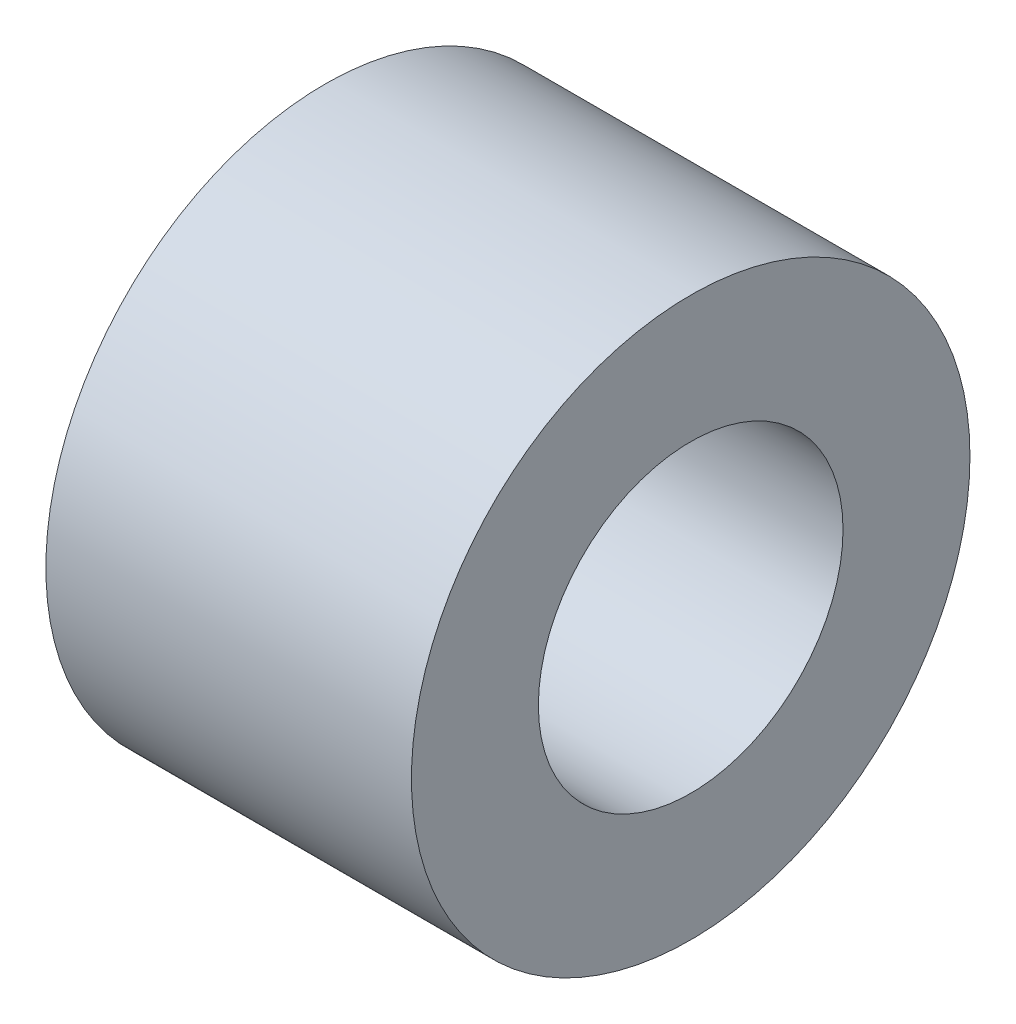
ISO-10303-21;
HEADER;
FILE_DESCRIPTION(('STEP AP214'),'2;1');
FILE_NAME('part.step','',(''),(''),'','','');
FILE_SCHEMA(('AUTOMOTIVE_DESIGN { 1 0 10303 214 1 1 1 1 }'));
ENDSEC;
DATA;
#1=APPLICATION_CONTEXT('core data for automotive mechanical design processes');
#2=APPLICATION_PROTOCOL_DEFINITION('international standard','automotive_design',2000,#1);
#3=PRODUCT_CONTEXT('',#1,'mechanical');
#4=PRODUCT('Part','Part','',(#3));
#5=PRODUCT_RELATED_PRODUCT_CATEGORY('part','',(#4));
#6=PRODUCT_DEFINITION_FORMATION('','',#4);
#7=PRODUCT_DEFINITION_CONTEXT('part definition',#1,'design');
#8=PRODUCT_DEFINITION('design','',#6,#7);
#9=PRODUCT_DEFINITION_SHAPE('','',#8);
#10=(LENGTH_UNIT() NAMED_UNIT(*) SI_UNIT(.MILLI.,.METRE.));
#11=(NAMED_UNIT(*) PLANE_ANGLE_UNIT() SI_UNIT($,.RADIAN.));
#12=(NAMED_UNIT(*) SI_UNIT($,.STERADIAN.) SOLID_ANGLE_UNIT());
#13=UNCERTAINTY_MEASURE_WITH_UNIT(LENGTH_MEASURE(1.E-05),#10,'distance_accuracy_value','');
#14=(GEOMETRIC_REPRESENTATION_CONTEXT(3) GLOBAL_UNCERTAINTY_ASSIGNED_CONTEXT((#13)) GLOBAL_UNIT_ASSIGNED_CONTEXT((#10,
#11,#12)) REPRESENTATION_CONTEXT('',''));
#15=CARTESIAN_POINT('',(0.,0.,0.));
#16=DIRECTION('',(0.,0.,1.));
#17=DIRECTION('',(1.,0.,0.));
#18=AXIS2_PLACEMENT_3D('',#15,#16,#17);
#19=CARTESIAN_POINT('',(3.6,0.,0.));
#20=DIRECTION('',(1.,0.,0.));
#21=DIRECTION('',(0.,0.,-1.));
#22=AXIS2_PLACEMENT_3D('',#19,#20,#21);
#23=PLANE('',#22);
#24=CARTESIAN_POINT('',(3.6,0.,0.));
#25=DIRECTION('',(1.,0.,0.));
#26=DIRECTION('',(0.,0.,-1.));
#27=AXIS2_PLACEMENT_3D('',#24,#25,#26);
#28=CIRCLE('',#27,2.75);
#29=CARTESIAN_POINT('',(3.6,0.,-2.75));
#30=VERTEX_POINT('',#29);
#31=EDGE_CURVE('E10',#30,#30,#28,.T.);
#32=ORIENTED_EDGE('',*,*,#31,.T.);
#33=EDGE_LOOP('',(#32));
#34=FACE_BOUND('',#33,.T.);
#35=CARTESIAN_POINT('',(3.6,0.,0.));
#36=DIRECTION('',(1.,0.,0.));
#37=DIRECTION('',(0.,0.,-1.));
#38=AXIS2_PLACEMENT_3D('',#35,#36,#37);
#39=CIRCLE('',#38,1.5);
#40=CARTESIAN_POINT('',(3.6,0.,-1.5));
#41=VERTEX_POINT('',#40);
#42=EDGE_CURVE('E54',#41,#41,#39,.T.);
#43=ORIENTED_EDGE('',*,*,#42,.F.);
#44=EDGE_LOOP('',(#43));
#45=FACE_BOUND('',#44,.T.);
#46=ADVANCED_FACE('F41',(#34,#45),#23,.T.);
#47=CARTESIAN_POINT('',(0.,0.,0.));
#48=DIRECTION('',(1.,0.,0.));
#49=DIRECTION('',(0.,0.,-1.));
#50=AXIS2_PLACEMENT_3D('',#47,#48,#49);
#51=PLANE('',#50);
#52=CARTESIAN_POINT('',(0.,0.,0.));
#53=DIRECTION('',(1.,0.,0.));
#54=DIRECTION('',(0.,0.,-1.));
#55=AXIS2_PLACEMENT_3D('',#52,#53,#54);
#56=CIRCLE('',#55,2.75);
#57=CARTESIAN_POINT('',(0.,0.,-2.75));
#58=VERTEX_POINT('',#57);
#59=EDGE_CURVE('E45',#58,#58,#56,.T.);
#60=ORIENTED_EDGE('',*,*,#59,.F.);
#61=EDGE_LOOP('',(#60));
#62=FACE_BOUND('',#61,.T.);
#63=CARTESIAN_POINT('',(0.,0.,0.));
#64=DIRECTION('',(1.,0.,0.));
#65=DIRECTION('',(0.,0.,-1.));
#66=AXIS2_PLACEMENT_3D('',#63,#64,#65);
#67=CIRCLE('',#66,1.5);
#68=CARTESIAN_POINT('',(0.,0.,-1.5));
#69=VERTEX_POINT('',#68);
#70=EDGE_CURVE('E56',#69,#69,#67,.T.);
#71=ORIENTED_EDGE('',*,*,#70,.T.);
#72=EDGE_LOOP('',(#71));
#73=FACE_BOUND('',#72,.T.);
#74=ADVANCED_FACE('F68',(#62,#73),#51,.F.);
#75=CARTESIAN_POINT('',(3.6,0.,0.));
#76=DIRECTION('',(-1.,0.,0.));
#77=DIRECTION('',(0.,0.,1.));
#78=AXIS2_PLACEMENT_3D('',#75,#76,#77);
#79=CYLINDRICAL_SURFACE('',#78,2.75);
#80=ORIENTED_EDGE('',*,*,#31,.F.);
#81=EDGE_LOOP('',(#80));
#82=FACE_BOUND('',#81,.T.);
#83=ORIENTED_EDGE('',*,*,#59,.T.);
#84=EDGE_LOOP('',(#83));
#85=FACE_BOUND('',#84,.T.);
#86=ADVANCED_FACE('F43',(#82,#85),#79,.T.);
#87=CARTESIAN_POINT('',(3.6,0.,0.));
#88=DIRECTION('',(-1.,0.,0.));
#89=DIRECTION('',(0.,0.,1.));
#90=AXIS2_PLACEMENT_3D('',#87,#88,#89);
#91=CYLINDRICAL_SURFACE('',#90,1.5);
#92=ORIENTED_EDGE('',*,*,#42,.T.);
#93=EDGE_LOOP('',(#92));
#94=FACE_BOUND('',#93,.T.);
#95=ORIENTED_EDGE('',*,*,#70,.F.);
#96=EDGE_LOOP('',(#95));
#97=FACE_BOUND('',#96,.T.);
#98=ADVANCED_FACE('F64',(#94,#97),#91,.F.);
#99=CLOSED_SHELL('',(#46,#74,#86,#98));
#100=MANIFOLD_SOLID_BREP('B2',#99);
#101=ADVANCED_BREP_SHAPE_REPRESENTATION('',(#18,#100),#14);
#102=SHAPE_DEFINITION_REPRESENTATION(#9,#101);
ENDSEC;
END-ISO-10303-21;
